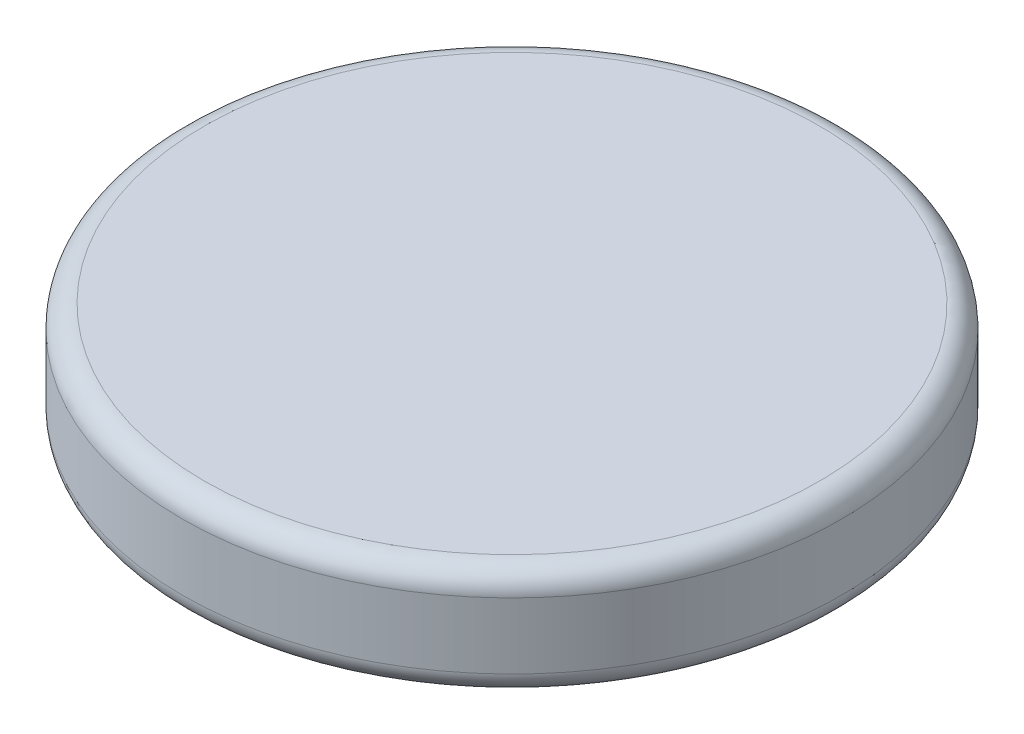
ISO-10303-21;
HEADER;
FILE_DESCRIPTION(('STEP AP214'),'2;1');
FILE_NAME('part.step','',(''),(''),'','','');
FILE_SCHEMA(('AUTOMOTIVE_DESIGN { 1 0 10303 214 1 1 1 1 }'));
ENDSEC;
DATA;
#1=APPLICATION_CONTEXT('core data for automotive mechanical design processes');
#2=APPLICATION_PROTOCOL_DEFINITION('international standard','automotive_design',2000,#1);
#3=PRODUCT_CONTEXT('',#1,'mechanical');
#4=PRODUCT('Part','Part','',(#3));
#5=PRODUCT_RELATED_PRODUCT_CATEGORY('part','',(#4));
#6=PRODUCT_DEFINITION_FORMATION('','',#4);
#7=PRODUCT_DEFINITION_CONTEXT('part definition',#1,'design');
#8=PRODUCT_DEFINITION('design','',#6,#7);
#9=PRODUCT_DEFINITION_SHAPE('','',#8);
#10=(LENGTH_UNIT() NAMED_UNIT(*) SI_UNIT(.MILLI.,.METRE.));
#11=(NAMED_UNIT(*) PLANE_ANGLE_UNIT() SI_UNIT($,.RADIAN.));
#12=(NAMED_UNIT(*) SI_UNIT($,.STERADIAN.) SOLID_ANGLE_UNIT());
#13=UNCERTAINTY_MEASURE_WITH_UNIT(LENGTH_MEASURE(1.E-05),#10,'distance_accuracy_value','');
#14=(GEOMETRIC_REPRESENTATION_CONTEXT(3) GLOBAL_UNCERTAINTY_ASSIGNED_CONTEXT((#13)) GLOBAL_UNIT_ASSIGNED_CONTEXT((#10,
#11,#12)) REPRESENTATION_CONTEXT('',''));
#15=CARTESIAN_POINT('',(0.,0.,0.));
#16=DIRECTION('',(0.,0.,1.));
#17=DIRECTION('',(1.,0.,0.));
#18=AXIS2_PLACEMENT_3D('',#15,#16,#17);
#19=CARTESIAN_POINT('',(0.,1.,0.));
#20=DIRECTION('',(0.,-1.,0.));
#21=DIRECTION('',(0.,0.,-1.));
#22=AXIS2_PLACEMENT_3D('',#19,#20,#21);
#23=CYLINDRICAL_SURFACE('',#22,3.);
#24=CARTESIAN_POINT('',(0.,0.2,0.));
#25=DIRECTION('',(0.,1.,0.));
#26=DIRECTION('',(0.,0.,1.));
#27=AXIS2_PLACEMENT_3D('',#24,#25,#26);
#28=CIRCLE('',#27,3.);
#29=CARTESIAN_POINT('',(0.,0.2,3.));
#30=VERTEX_POINT('',#29);
#31=EDGE_CURVE('E44',#30,#30,#28,.T.);
#32=ORIENTED_EDGE('',*,*,#31,.T.);
#33=EDGE_LOOP('',(#32));
#34=FACE_BOUND('',#33,.T.);
#35=CARTESIAN_POINT('',(0.,0.8,0.));
#36=DIRECTION('',(0.,1.,0.));
#37=DIRECTION('',(0.,0.,1.));
#38=AXIS2_PLACEMENT_3D('',#35,#36,#37);
#39=CIRCLE('',#38,3.);
#40=CARTESIAN_POINT('',(0.,0.8,3.));
#41=VERTEX_POINT('',#40);
#42=EDGE_CURVE('E48',#41,#41,#39,.F.);
#43=ORIENTED_EDGE('',*,*,#42,.T.);
#44=EDGE_LOOP('',(#43));
#45=FACE_BOUND('',#44,.T.);
#46=ADVANCED_FACE('F33',(#34,#45),#23,.T.);
#47=CARTESIAN_POINT('',(0.,1.,0.));
#48=DIRECTION('',(0.,1.,0.));
#49=DIRECTION('',(0.,0.,1.));
#50=AXIS2_PLACEMENT_3D('',#47,#48,#49);
#51=PLANE('',#50);
#52=CARTESIAN_POINT('',(0.,1.,0.));
#53=DIRECTION('',(0.,1.,0.));
#54=DIRECTION('',(0.,0.,1.));
#55=AXIS2_PLACEMENT_3D('',#52,#53,#54);
#56=CIRCLE('',#55,2.8);
#57=CARTESIAN_POINT('',(0.,1.,2.8));
#58=VERTEX_POINT('',#57);
#59=EDGE_CURVE('E10',#58,#58,#56,.T.);
#60=ORIENTED_EDGE('',*,*,#59,.T.);
#61=EDGE_LOOP('',(#60));
#62=FACE_BOUND('',#61,.T.);
#63=ADVANCED_FACE('F64',(#62),#51,.T.);
#64=CARTESIAN_POINT('',(0.,0.,0.));
#65=DIRECTION('',(0.,1.,0.));
#66=DIRECTION('',(0.,0.,1.));
#67=AXIS2_PLACEMENT_3D('',#64,#65,#66);
#68=PLANE('',#67);
#69=CARTESIAN_POINT('',(0.,0.,0.));
#70=DIRECTION('',(0.,1.,0.));
#71=DIRECTION('',(0.,0.,1.));
#72=AXIS2_PLACEMENT_3D('',#69,#70,#71);
#73=CIRCLE('',#72,2.8);
#74=CARTESIAN_POINT('',(0.,0.,2.8));
#75=VERTEX_POINT('',#74);
#76=EDGE_CURVE('E40',#75,#75,#73,.F.);
#77=ORIENTED_EDGE('',*,*,#76,.T.);
#78=EDGE_LOOP('',(#77));
#79=FACE_BOUND('',#78,.T.);
#80=ADVANCED_FACE('F61',(#79),#68,.F.);
#81=CARTESIAN_POINT('',(0.,0.2,0.));
#82=DIRECTION('',(0.,1.,0.));
#83=DIRECTION('',(0.,0.,1.));
#84=AXIS2_PLACEMENT_3D('',#81,#82,#83);
#85=TOROIDAL_SURFACE('',#84,2.8,0.2);
#86=ORIENTED_EDGE('',*,*,#76,.F.);
#87=EDGE_LOOP('',(#86));
#88=FACE_BOUND('',#87,.T.);
#89=ORIENTED_EDGE('',*,*,#31,.F.);
#90=EDGE_LOOP('',(#89));
#91=FACE_BOUND('',#90,.T.);
#92=ADVANCED_FACE('F57',(#88,#91),#85,.T.);
#93=CARTESIAN_POINT('',(0.,0.8,0.));
#94=DIRECTION('',(0.,1.,0.));
#95=DIRECTION('',(0.,0.,1.));
#96=AXIS2_PLACEMENT_3D('',#93,#94,#95);
#97=TOROIDAL_SURFACE('',#96,2.8,0.2);
#98=ORIENTED_EDGE('',*,*,#42,.F.);
#99=EDGE_LOOP('',(#98));
#100=FACE_BOUND('',#99,.T.);
#101=ORIENTED_EDGE('',*,*,#59,.F.);
#102=EDGE_LOOP('',(#101));
#103=FACE_BOUND('',#102,.T.);
#104=ADVANCED_FACE('F35',(#100,#103),#97,.T.);
#105=CLOSED_SHELL('',(#46,#63,#80,#92,#104));
#106=MANIFOLD_SOLID_BREP('B2',#105);
#107=ADVANCED_BREP_SHAPE_REPRESENTATION('',(#18,#106),#14);
#108=SHAPE_DEFINITION_REPRESENTATION(#9,#107);
ENDSEC;
END-ISO-10303-21;
